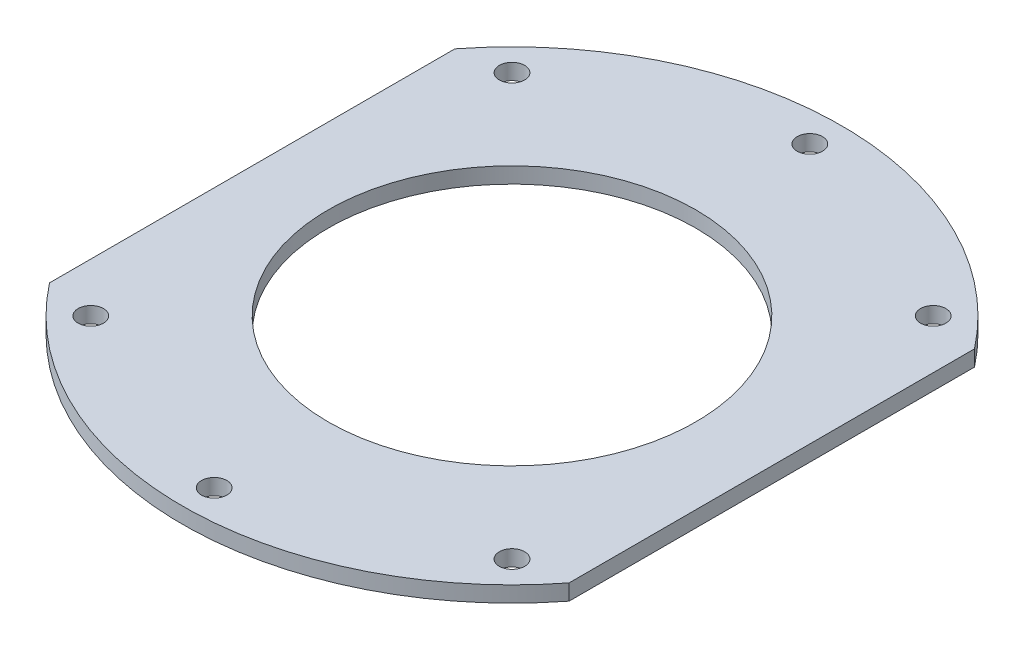
ISO-10303-21;
HEADER;
FILE_DESCRIPTION(('STEP AP214'),'2;1');
FILE_NAME('part.step','',(''),(''),'','','');
FILE_SCHEMA(('AUTOMOTIVE_DESIGN { 1 0 10303 214 1 1 1 1 }'));
ENDSEC;
DATA;
#1=APPLICATION_CONTEXT('core data for automotive mechanical design processes');
#2=APPLICATION_PROTOCOL_DEFINITION('international standard','automotive_design',2000,#1);
#3=PRODUCT_CONTEXT('',#1,'mechanical');
#4=PRODUCT('Part','Part','',(#3));
#5=PRODUCT_RELATED_PRODUCT_CATEGORY('part','',(#4));
#6=PRODUCT_DEFINITION_FORMATION('','',#4);
#7=PRODUCT_DEFINITION_CONTEXT('part definition',#1,'design');
#8=PRODUCT_DEFINITION('design','',#6,#7);
#9=PRODUCT_DEFINITION_SHAPE('','',#8);
#10=(LENGTH_UNIT() NAMED_UNIT(*) SI_UNIT(.MILLI.,.METRE.));
#11=(NAMED_UNIT(*) PLANE_ANGLE_UNIT() SI_UNIT($,.RADIAN.));
#12=(NAMED_UNIT(*) SI_UNIT($,.STERADIAN.) SOLID_ANGLE_UNIT());
#13=UNCERTAINTY_MEASURE_WITH_UNIT(LENGTH_MEASURE(1.E-05),#10,'distance_accuracy_value','');
#14=(GEOMETRIC_REPRESENTATION_CONTEXT(3) GLOBAL_UNCERTAINTY_ASSIGNED_CONTEXT((#13)) GLOBAL_UNIT_ASSIGNED_CONTEXT((#10,
#11,#12)) REPRESENTATION_CONTEXT('',''));
#15=CARTESIAN_POINT('',(0.,0.,0.));
#16=DIRECTION('',(0.,0.,1.));
#17=DIRECTION('',(1.,0.,0.));
#18=AXIS2_PLACEMENT_3D('',#15,#16,#17);
#19=CARTESIAN_POINT('',(0.,2.5,0.));
#20=DIRECTION('',(0.,1.,0.));
#21=DIRECTION('',(0.,0.,1.));
#22=AXIS2_PLACEMENT_3D('',#19,#20,#21);
#23=PLANE('',#22);
#24=CARTESIAN_POINT('',(0.,2.5,-47.));
#25=DIRECTION('',(0.,1.,0.));
#26=DIRECTION('',(0.,0.,1.));
#27=AXIS2_PLACEMENT_3D('',#24,#25,#26);
#28=CIRCLE('',#27,2.00000000000001);
#29=CARTESIAN_POINT('',(0.,2.5,-45.));
#30=VERTEX_POINT('',#29);
#31=EDGE_CURVE('E266',#30,#30,#28,.T.);
#32=ORIENTED_EDGE('',*,*,#31,.F.);
#33=EDGE_LOOP('',(#32));
#34=FACE_BOUND('',#33,.T.);
#35=CARTESIAN_POINT('',(0.,2.5,47.));
#36=DIRECTION('',(0.,1.,0.));
#37=DIRECTION('',(0.,0.,1.));
#38=AXIS2_PLACEMENT_3D('',#35,#36,#37);
#39=CIRCLE('',#38,2.);
#40=CARTESIAN_POINT('',(0.,2.5,49.));
#41=VERTEX_POINT('',#40);
#42=EDGE_CURVE('E284',#41,#41,#39,.T.);
#43=ORIENTED_EDGE('',*,*,#42,.F.);
#44=EDGE_LOOP('',(#43));
#45=FACE_BOUND('',#44,.T.);
#46=CARTESIAN_POINT('',(0.,2.5,0.));
#47=DIRECTION('',(0.,1.,0.));
#48=DIRECTION('',(0.,0.,1.));
#49=AXIS2_PLACEMENT_3D('',#46,#47,#48);
#50=CIRCLE('',#49,29.);
#51=CARTESIAN_POINT('',(0.,2.5,29.));
#52=VERTEX_POINT('',#51);
#53=EDGE_CURVE('E123',#52,#52,#50,.T.);
#54=ORIENTED_EDGE('',*,*,#53,.F.);
#55=EDGE_LOOP('',(#54));
#56=FACE_BOUND('',#55,.T.);
#57=CARTESIAN_POINT('',(33.2340187157677,2.5,33.2340187157677));
#58=DIRECTION('',(0.,1.,0.));
#59=DIRECTION('',(0.,0.,1.));
#60=AXIS2_PLACEMENT_3D('',#57,#58,#59);
#61=CIRCLE('',#60,2.);
#62=CARTESIAN_POINT('',(33.2340187157677,2.5,35.2340187157677));
#63=VERTEX_POINT('',#62);
#64=EDGE_CURVE('E290',#63,#63,#61,.T.);
#65=ORIENTED_EDGE('',*,*,#64,.F.);
#66=EDGE_LOOP('',(#65));
#67=FACE_BOUND('',#66,.T.);
#68=CARTESIAN_POINT('',(-33.2340187157677,2.5,33.2340187157677));
#69=DIRECTION('',(0.,1.,0.));
#70=DIRECTION('',(0.,0.,1.));
#71=AXIS2_PLACEMENT_3D('',#68,#69,#70);
#72=CIRCLE('',#71,2.00000000000001);
#73=CARTESIAN_POINT('',(-33.2340187157677,2.5,35.2340187157677));
#74=VERTEX_POINT('',#73);
#75=EDGE_CURVE('E278',#74,#74,#72,.T.);
#76=ORIENTED_EDGE('',*,*,#75,.F.);
#77=EDGE_LOOP('',(#76));
#78=FACE_BOUND('',#77,.T.);
#79=CARTESIAN_POINT('',(-33.2340187157677,2.5,-33.2340187157677));
#80=DIRECTION('',(0.,1.,0.));
#81=DIRECTION('',(0.,0.,1.));
#82=AXIS2_PLACEMENT_3D('',#79,#80,#81);
#83=CIRCLE('',#82,2.00000000000001);
#84=CARTESIAN_POINT('',(-33.2340187157677,2.5,-31.2340187157677));
#85=VERTEX_POINT('',#84);
#86=EDGE_CURVE('E272',#85,#85,#83,.T.);
#87=ORIENTED_EDGE('',*,*,#86,.F.);
#88=EDGE_LOOP('',(#87));
#89=FACE_BOUND('',#88,.T.);
#90=CARTESIAN_POINT('',(33.2340187157677,2.5,-33.2340187157677));
#91=DIRECTION('',(0.,1.,0.));
#92=DIRECTION('',(0.,0.,1.));
#93=AXIS2_PLACEMENT_3D('',#90,#91,#92);
#94=CIRCLE('',#93,2.00000000000001);
#95=CARTESIAN_POINT('',(33.2340187157677,2.5,-31.2340187157677));
#96=VERTEX_POINT('',#95);
#97=EDGE_CURVE('E256',#96,#96,#94,.T.);
#98=ORIENTED_EDGE('',*,*,#97,.F.);
#99=EDGE_LOOP('',(#98));
#100=FACE_BOUND('',#99,.T.);
#101=CARTESIAN_POINT('',(0.,2.5,0.));
#102=DIRECTION('',(0.,1.,0.));
#103=DIRECTION('',(0.,0.,1.));
#104=AXIS2_PLACEMENT_3D('',#101,#102,#103);
#105=CIRCLE('',#104,52.);
#106=CARTESIAN_POINT('',(-41.,2.5,31.984371183439));
#107=VERTEX_POINT('',#106);
#108=CARTESIAN_POINT('',(41.,2.5,31.984371183439));
#109=VERTEX_POINT('',#108);
#110=EDGE_CURVE('E109',#107,#109,#105,.T.);
#111=ORIENTED_EDGE('',*,*,#110,.T.);
#112=DIRECTION('',(0.,0.,-1.));
#113=VECTOR('',#112,1.);
#114=CARTESIAN_POINT('',(41.,2.5,55.0176136765046));
#115=LINE('',#114,#113);
#116=CARTESIAN_POINT('',(41.,2.5,-31.984371183439));
#117=VERTEX_POINT('',#116);
#118=EDGE_CURVE('E97',#109,#117,#115,.T.);
#119=ORIENTED_EDGE('',*,*,#118,.T.);
#120=CARTESIAN_POINT('',(-41.,2.5,-31.984371183439));
#121=VERTEX_POINT('',#120);
#122=EDGE_CURVE('E113',#117,#121,#105,.T.);
#123=ORIENTED_EDGE('',*,*,#122,.T.);
#124=DIRECTION('',(0.,0.,1.));
#125=VECTOR('',#124,1.);
#126=CARTESIAN_POINT('',(-41.,2.5,55.0176136765046));
#127=LINE('',#126,#125);
#128=EDGE_CURVE('E104',#121,#107,#127,.T.);
#129=ORIENTED_EDGE('',*,*,#128,.T.);
#130=EDGE_LOOP('',(#111,#119,#123,#129));
#131=FACE_BOUND('',#130,.T.);
#132=ADVANCED_FACE('F59',(#34,#45,#56,#67,#78,#89,#100,#131),#23,.T.);
#133=CARTESIAN_POINT('',(0.,0.,0.));
#134=DIRECTION('',(0.,1.,0.));
#135=DIRECTION('',(0.,0.,1.));
#136=AXIS2_PLACEMENT_3D('',#133,#134,#135);
#137=PLANE('',#136);
#138=CARTESIAN_POINT('',(0.,0.,0.));
#139=DIRECTION('',(0.,1.,0.));
#140=DIRECTION('',(0.,0.,1.));
#141=AXIS2_PLACEMENT_3D('',#138,#139,#140);
#142=CIRCLE('',#141,29.);
#143=CARTESIAN_POINT('',(0.,0.,29.));
#144=VERTEX_POINT('',#143);
#145=EDGE_CURVE('E120',#144,#144,#142,.T.);
#146=ORIENTED_EDGE('',*,*,#145,.T.);
#147=EDGE_LOOP('',(#146));
#148=FACE_BOUND('',#147,.T.);
#149=CARTESIAN_POINT('',(33.2340187157677,0.,33.2340187157677));
#150=DIRECTION('',(0.,1.,0.));
#151=DIRECTION('',(0.,0.,1.));
#152=AXIS2_PLACEMENT_3D('',#149,#150,#151);
#153=CIRCLE('',#152,2.);
#154=CARTESIAN_POINT('',(33.2340187157677,0.,35.2340187157677));
#155=VERTEX_POINT('',#154);
#156=EDGE_CURVE('E287',#155,#155,#153,.T.);
#157=ORIENTED_EDGE('',*,*,#156,.T.);
#158=EDGE_LOOP('',(#157));
#159=FACE_BOUND('',#158,.T.);
#160=CARTESIAN_POINT('',(0.,0.,47.));
#161=DIRECTION('',(0.,1.,0.));
#162=DIRECTION('',(0.,0.,1.));
#163=AXIS2_PLACEMENT_3D('',#160,#161,#162);
#164=CIRCLE('',#163,2.);
#165=CARTESIAN_POINT('',(0.,0.,49.));
#166=VERTEX_POINT('',#165);
#167=EDGE_CURVE('E281',#166,#166,#164,.T.);
#168=ORIENTED_EDGE('',*,*,#167,.T.);
#169=EDGE_LOOP('',(#168));
#170=FACE_BOUND('',#169,.T.);
#171=CARTESIAN_POINT('',(-33.2340187157677,0.,33.2340187157677));
#172=DIRECTION('',(0.,1.,0.));
#173=DIRECTION('',(0.,0.,1.));
#174=AXIS2_PLACEMENT_3D('',#171,#172,#173);
#175=CIRCLE('',#174,2.00000000000001);
#176=CARTESIAN_POINT('',(-33.2340187157677,0.,35.2340187157677));
#177=VERTEX_POINT('',#176);
#178=EDGE_CURVE('E275',#177,#177,#175,.T.);
#179=ORIENTED_EDGE('',*,*,#178,.T.);
#180=EDGE_LOOP('',(#179));
#181=FACE_BOUND('',#180,.T.);
#182=CARTESIAN_POINT('',(-33.2340187157677,0.,-33.2340187157677));
#183=DIRECTION('',(0.,1.,0.));
#184=DIRECTION('',(0.,0.,1.));
#185=AXIS2_PLACEMENT_3D('',#182,#183,#184);
#186=CIRCLE('',#185,2.00000000000001);
#187=CARTESIAN_POINT('',(-33.2340187157677,0.,-31.2340187157677));
#188=VERTEX_POINT('',#187);
#189=EDGE_CURVE('E269',#188,#188,#186,.T.);
#190=ORIENTED_EDGE('',*,*,#189,.T.);
#191=EDGE_LOOP('',(#190));
#192=FACE_BOUND('',#191,.T.);
#193=CARTESIAN_POINT('',(0.,0.,-47.));
#194=DIRECTION('',(0.,1.,0.));
#195=DIRECTION('',(0.,0.,1.));
#196=AXIS2_PLACEMENT_3D('',#193,#194,#195);
#197=CIRCLE('',#196,2.00000000000001);
#198=CARTESIAN_POINT('',(0.,0.,-45.));
#199=VERTEX_POINT('',#198);
#200=EDGE_CURVE('E262',#199,#199,#197,.T.);
#201=ORIENTED_EDGE('',*,*,#200,.T.);
#202=EDGE_LOOP('',(#201));
#203=FACE_BOUND('',#202,.T.);
#204=CARTESIAN_POINT('',(33.2340187157677,0.,-33.2340187157677));
#205=DIRECTION('',(0.,1.,0.));
#206=DIRECTION('',(0.,0.,1.));
#207=AXIS2_PLACEMENT_3D('',#204,#205,#206);
#208=CIRCLE('',#207,2.00000000000001);
#209=CARTESIAN_POINT('',(33.2340187157677,0.,-31.2340187157677));
#210=VERTEX_POINT('',#209);
#211=EDGE_CURVE('E259',#210,#210,#208,.T.);
#212=ORIENTED_EDGE('',*,*,#211,.T.);
#213=EDGE_LOOP('',(#212));
#214=FACE_BOUND('',#213,.T.);
#215=DIRECTION('',(0.,0.,-1.));
#216=VECTOR('',#215,1.);
#217=CARTESIAN_POINT('',(41.,0.,0.));
#218=LINE('',#217,#216);
#219=CARTESIAN_POINT('',(41.,0.,31.984371183439));
#220=VERTEX_POINT('',#219);
#221=CARTESIAN_POINT('',(41.,0.,-31.984371183439));
#222=VERTEX_POINT('',#221);
#223=EDGE_CURVE('E81',#220,#222,#218,.T.);
#224=ORIENTED_EDGE('',*,*,#223,.F.);
#225=CARTESIAN_POINT('',(0.,0.,0.));
#226=DIRECTION('',(0.,1.,0.));
#227=DIRECTION('',(0.,0.,1.));
#228=AXIS2_PLACEMENT_3D('',#225,#226,#227);
#229=CIRCLE('',#228,52.);
#230=CARTESIAN_POINT('',(-41.,0.,31.984371183439));
#231=VERTEX_POINT('',#230);
#232=EDGE_CURVE('E111',#231,#220,#229,.T.);
#233=ORIENTED_EDGE('',*,*,#232,.F.);
#234=DIRECTION('',(0.,0.,1.));
#235=VECTOR('',#234,1.);
#236=CARTESIAN_POINT('',(-41.,0.,0.));
#237=LINE('',#236,#235);
#238=CARTESIAN_POINT('',(-41.,0.,-31.984371183439));
#239=VERTEX_POINT('',#238);
#240=EDGE_CURVE('E74',#239,#231,#237,.T.);
#241=ORIENTED_EDGE('',*,*,#240,.F.);
#242=EDGE_CURVE('E114',#222,#239,#229,.T.);
#243=ORIENTED_EDGE('',*,*,#242,.F.);
#244=EDGE_LOOP('',(#224,#233,#241,#243));
#245=FACE_BOUND('',#244,.T.);
#246=ADVANCED_FACE('F131',(#148,#159,#170,#181,#192,#203,#214,#245),#137,.F.);
#247=CARTESIAN_POINT('',(0.,2.5,0.));
#248=DIRECTION('',(0.,-1.,0.));
#249=DIRECTION('',(0.,0.,-1.));
#250=AXIS2_PLACEMENT_3D('',#247,#248,#249);
#251=CYLINDRICAL_SURFACE('',#250,52.);
#252=DIRECTION('',(0.,-1.,0.));
#253=VECTOR('',#252,1.);
#254=CARTESIAN_POINT('',(41.,2.5,31.984371183439));
#255=LINE('',#254,#253);
#256=EDGE_CURVE('E12',#109,#220,#255,.T.);
#257=ORIENTED_EDGE('',*,*,#256,.F.);
#258=ORIENTED_EDGE('',*,*,#110,.F.);
#259=DIRECTION('',(0.,-1.,0.));
#260=VECTOR('',#259,1.);
#261=CARTESIAN_POINT('',(-41.,2.5,31.984371183439));
#262=LINE('',#261,#260);
#263=EDGE_CURVE('E116',#231,#107,#262,.F.);
#264=ORIENTED_EDGE('',*,*,#263,.F.);
#265=ORIENTED_EDGE('',*,*,#232,.T.);
#266=EDGE_LOOP('',(#257,#258,#264,#265));
#267=FACE_BOUND('',#266,.T.);
#268=ADVANCED_FACE('F61',(#267),#251,.T.);
#269=DIRECTION('',(0.,-1.,0.));
#270=VECTOR('',#269,1.);
#271=CARTESIAN_POINT('',(41.,2.5,-31.984371183439));
#272=LINE('',#271,#270);
#273=EDGE_CURVE('E67',#222,#117,#272,.F.);
#274=ORIENTED_EDGE('',*,*,#273,.F.);
#275=ORIENTED_EDGE('',*,*,#242,.T.);
#276=DIRECTION('',(0.,-1.,0.));
#277=VECTOR('',#276,1.);
#278=CARTESIAN_POINT('',(-41.,2.5,-31.984371183439));
#279=LINE('',#278,#277);
#280=EDGE_CURVE('E125',#121,#239,#279,.T.);
#281=ORIENTED_EDGE('',*,*,#280,.F.);
#282=ORIENTED_EDGE('',*,*,#122,.F.);
#283=EDGE_LOOP('',(#274,#275,#281,#282));
#284=FACE_BOUND('',#283,.T.);
#285=ADVANCED_FACE('F133',(#284),#251,.T.);
#286=CARTESIAN_POINT('',(0.,2.5,0.));
#287=DIRECTION('',(0.,-1.,0.));
#288=DIRECTION('',(0.,0.,-1.));
#289=AXIS2_PLACEMENT_3D('',#286,#287,#288);
#290=CYLINDRICAL_SURFACE('',#289,29.);
#291=ORIENTED_EDGE('',*,*,#53,.T.);
#292=EDGE_LOOP('',(#291));
#293=FACE_BOUND('',#292,.T.);
#294=ORIENTED_EDGE('',*,*,#145,.F.);
#295=EDGE_LOOP('',(#294));
#296=FACE_BOUND('',#295,.T.);
#297=ADVANCED_FACE('F135',(#293,#296),#290,.F.);
#298=CARTESIAN_POINT('',(33.2340187157677,2.5,33.2340187157677));
#299=DIRECTION('',(0.,-1.,0.));
#300=DIRECTION('',(0.,0.,-1.));
#301=AXIS2_PLACEMENT_3D('',#298,#299,#300);
#302=CYLINDRICAL_SURFACE('',#301,2.);
#303=ORIENTED_EDGE('',*,*,#64,.T.);
#304=EDGE_LOOP('',(#303));
#305=FACE_BOUND('',#304,.T.);
#306=ORIENTED_EDGE('',*,*,#156,.F.);
#307=EDGE_LOOP('',(#306));
#308=FACE_BOUND('',#307,.T.);
#309=ADVANCED_FACE('F140',(#305,#308),#302,.F.);
#310=CARTESIAN_POINT('',(0.,2.5,47.));
#311=DIRECTION('',(0.,-1.,0.));
#312=DIRECTION('',(0.,0.,-1.));
#313=AXIS2_PLACEMENT_3D('',#310,#311,#312);
#314=CYLINDRICAL_SURFACE('',#313,2.);
#315=ORIENTED_EDGE('',*,*,#42,.T.);
#316=EDGE_LOOP('',(#315));
#317=FACE_BOUND('',#316,.T.);
#318=ORIENTED_EDGE('',*,*,#167,.F.);
#319=EDGE_LOOP('',(#318));
#320=FACE_BOUND('',#319,.T.);
#321=ADVANCED_FACE('F155',(#317,#320),#314,.F.);
#322=CARTESIAN_POINT('',(-33.2340187157677,2.5,33.2340187157677));
#323=DIRECTION('',(0.,-1.,0.));
#324=DIRECTION('',(0.,0.,-1.));
#325=AXIS2_PLACEMENT_3D('',#322,#323,#324);
#326=CYLINDRICAL_SURFACE('',#325,2.00000000000001);
#327=ORIENTED_EDGE('',*,*,#75,.T.);
#328=EDGE_LOOP('',(#327));
#329=FACE_BOUND('',#328,.T.);
#330=ORIENTED_EDGE('',*,*,#178,.F.);
#331=EDGE_LOOP('',(#330));
#332=FACE_BOUND('',#331,.T.);
#333=ADVANCED_FACE('F159',(#329,#332),#326,.F.);
#334=CARTESIAN_POINT('',(-33.2340187157677,2.5,-33.2340187157677));
#335=DIRECTION('',(0.,-1.,0.));
#336=DIRECTION('',(0.,0.,-1.));
#337=AXIS2_PLACEMENT_3D('',#334,#335,#336);
#338=CYLINDRICAL_SURFACE('',#337,2.00000000000001);
#339=ORIENTED_EDGE('',*,*,#86,.T.);
#340=EDGE_LOOP('',(#339));
#341=FACE_BOUND('',#340,.T.);
#342=ORIENTED_EDGE('',*,*,#189,.F.);
#343=EDGE_LOOP('',(#342));
#344=FACE_BOUND('',#343,.T.);
#345=ADVANCED_FACE('F163',(#341,#344),#338,.F.);
#346=CARTESIAN_POINT('',(0.,2.5,-47.));
#347=DIRECTION('',(0.,-1.,0.));
#348=DIRECTION('',(0.,0.,-1.));
#349=AXIS2_PLACEMENT_3D('',#346,#347,#348);
#350=CYLINDRICAL_SURFACE('',#349,2.00000000000001);
#351=ORIENTED_EDGE('',*,*,#31,.T.);
#352=EDGE_LOOP('',(#351));
#353=FACE_BOUND('',#352,.T.);
#354=ORIENTED_EDGE('',*,*,#200,.F.);
#355=EDGE_LOOP('',(#354));
#356=FACE_BOUND('',#355,.T.);
#357=ADVANCED_FACE('F167',(#353,#356),#350,.F.);
#358=CARTESIAN_POINT('',(33.2340187157677,2.5,-33.2340187157677));
#359=DIRECTION('',(0.,-1.,0.));
#360=DIRECTION('',(0.,0.,-1.));
#361=AXIS2_PLACEMENT_3D('',#358,#359,#360);
#362=CYLINDRICAL_SURFACE('',#361,2.00000000000001);
#363=ORIENTED_EDGE('',*,*,#97,.T.);
#364=EDGE_LOOP('',(#363));
#365=FACE_BOUND('',#364,.T.);
#366=ORIENTED_EDGE('',*,*,#211,.F.);
#367=EDGE_LOOP('',(#366));
#368=FACE_BOUND('',#367,.T.);
#369=ADVANCED_FACE('F171',(#365,#368),#362,.F.);
#370=CARTESIAN_POINT('',(-41.,-1.5,55.0176136765046));
#371=DIRECTION('',(-1.,0.,0.));
#372=DIRECTION('',(0.,0.,1.));
#373=AXIS2_PLACEMENT_3D('',#370,#371,#372);
#374=PLANE('',#373);
#375=ORIENTED_EDGE('',*,*,#280,.T.);
#376=ORIENTED_EDGE('',*,*,#240,.T.);
#377=ORIENTED_EDGE('',*,*,#263,.T.);
#378=ORIENTED_EDGE('',*,*,#128,.F.);
#379=EDGE_LOOP('',(#375,#376,#377,#378));
#380=FACE_BOUND('',#379,.T.);
#381=ADVANCED_FACE('F127',(#380),#374,.T.);
#382=CARTESIAN_POINT('',(41.,-1.5,55.0176136765046));
#383=DIRECTION('',(1.,0.,0.));
#384=DIRECTION('',(0.,0.,-1.));
#385=AXIS2_PLACEMENT_3D('',#382,#383,#384);
#386=PLANE('',#385);
#387=ORIENTED_EDGE('',*,*,#256,.T.);
#388=ORIENTED_EDGE('',*,*,#223,.T.);
#389=ORIENTED_EDGE('',*,*,#273,.T.);
#390=ORIENTED_EDGE('',*,*,#118,.F.);
#391=EDGE_LOOP('',(#387,#388,#389,#390));
#392=FACE_BOUND('',#391,.T.);
#393=ADVANCED_FACE('F99',(#392),#386,.T.);
#394=CLOSED_SHELL('',(#132,#246,#268,#285,#297,#309,#321,#333,#345,#357,#369,#381,#393));
#395=MANIFOLD_SOLID_BREP('B2',#394);
#396=ADVANCED_BREP_SHAPE_REPRESENTATION('',(#18,#395),#14);
#397=SHAPE_DEFINITION_REPRESENTATION(#9,#396);
ENDSEC;
END-ISO-10303-21;
